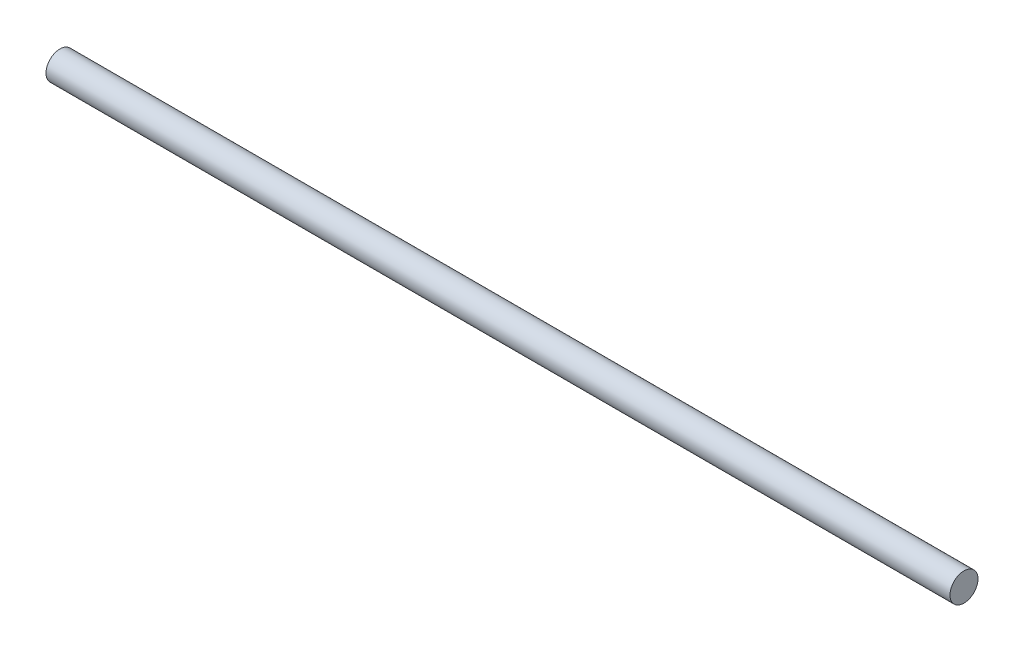
ISO-10303-21;
HEADER;
FILE_DESCRIPTION(('STEP AP214'),'2;1');
FILE_NAME('part.step','',(''),(''),'','','');
FILE_SCHEMA(('AUTOMOTIVE_DESIGN { 1 0 10303 214 1 1 1 1 }'));
ENDSEC;
DATA;
#1=APPLICATION_CONTEXT('core data for automotive mechanical design processes');
#2=APPLICATION_PROTOCOL_DEFINITION('international standard','automotive_design',2000,#1);
#3=PRODUCT_CONTEXT('',#1,'mechanical');
#4=PRODUCT('Part','Part','',(#3));
#5=PRODUCT_RELATED_PRODUCT_CATEGORY('part','',(#4));
#6=PRODUCT_DEFINITION_FORMATION('','',#4);
#7=PRODUCT_DEFINITION_CONTEXT('part definition',#1,'design');
#8=PRODUCT_DEFINITION('design','',#6,#7);
#9=PRODUCT_DEFINITION_SHAPE('','',#8);
#10=(LENGTH_UNIT() NAMED_UNIT(*) SI_UNIT(.MILLI.,.METRE.));
#11=(NAMED_UNIT(*) PLANE_ANGLE_UNIT() SI_UNIT($,.RADIAN.));
#12=(NAMED_UNIT(*) SI_UNIT($,.STERADIAN.) SOLID_ANGLE_UNIT());
#13=UNCERTAINTY_MEASURE_WITH_UNIT(LENGTH_MEASURE(1.E-05),#10,'distance_accuracy_value','');
#14=(GEOMETRIC_REPRESENTATION_CONTEXT(3) GLOBAL_UNCERTAINTY_ASSIGNED_CONTEXT((#13)) GLOBAL_UNIT_ASSIGNED_CONTEXT((#10,
#11,#12)) REPRESENTATION_CONTEXT('',''));
#15=CARTESIAN_POINT('',(0.,0.,0.));
#16=DIRECTION('',(0.,0.,1.));
#17=DIRECTION('',(1.,0.,0.));
#18=AXIS2_PLACEMENT_3D('',#15,#16,#17);
#19=CARTESIAN_POINT('',(290.5,0.,0.));
#20=DIRECTION('',(-1.,0.,0.));
#21=DIRECTION('',(0.,0.,1.));
#22=AXIS2_PLACEMENT_3D('',#19,#20,#21);
#23=CYLINDRICAL_SURFACE('',#22,9.);
#24=CARTESIAN_POINT('',(290.5,0.,0.));
#25=DIRECTION('',(1.,0.,0.));
#26=DIRECTION('',(0.,0.,-1.));
#27=AXIS2_PLACEMENT_3D('',#24,#25,#26);
#28=CIRCLE('',#27,9.);
#29=CARTESIAN_POINT('',(290.5,0.,-9.));
#30=VERTEX_POINT('',#29);
#31=EDGE_CURVE('E10',#30,#30,#28,.T.);
#32=ORIENTED_EDGE('',*,*,#31,.F.);
#33=EDGE_LOOP('',(#32));
#34=FACE_BOUND('',#33,.T.);
#35=CARTESIAN_POINT('',(-290.5,0.,0.));
#36=DIRECTION('',(1.,0.,0.));
#37=DIRECTION('',(0.,0.,-1.));
#38=AXIS2_PLACEMENT_3D('',#35,#36,#37);
#39=CIRCLE('',#38,9.);
#40=CARTESIAN_POINT('',(-290.5,0.,-9.));
#41=VERTEX_POINT('',#40);
#42=EDGE_CURVE('E34',#41,#41,#39,.T.);
#43=ORIENTED_EDGE('',*,*,#42,.T.);
#44=EDGE_LOOP('',(#43));
#45=FACE_BOUND('',#44,.T.);
#46=ADVANCED_FACE('F31',(#34,#45),#23,.T.);
#47=CARTESIAN_POINT('',(290.5,0.,0.));
#48=DIRECTION('',(1.,0.,0.));
#49=DIRECTION('',(0.,0.,-1.));
#50=AXIS2_PLACEMENT_3D('',#47,#48,#49);
#51=PLANE('',#50);
#52=ORIENTED_EDGE('',*,*,#31,.T.);
#53=EDGE_LOOP('',(#52));
#54=FACE_BOUND('',#53,.T.);
#55=ADVANCED_FACE('F46',(#54),#51,.T.);
#56=CARTESIAN_POINT('',(-290.5,0.,0.));
#57=DIRECTION('',(1.,0.,0.));
#58=DIRECTION('',(0.,0.,-1.));
#59=AXIS2_PLACEMENT_3D('',#56,#57,#58);
#60=PLANE('',#59);
#61=ORIENTED_EDGE('',*,*,#42,.F.);
#62=EDGE_LOOP('',(#61));
#63=FACE_BOUND('',#62,.T.);
#64=ADVANCED_FACE('F44',(#63),#60,.F.);
#65=CLOSED_SHELL('',(#46,#55,#64));
#66=MANIFOLD_SOLID_BREP('B2',#65);
#67=ADVANCED_BREP_SHAPE_REPRESENTATION('',(#18,#66),#14);
#68=SHAPE_DEFINITION_REPRESENTATION(#9,#67);
ENDSEC;
END-ISO-10303-21;
